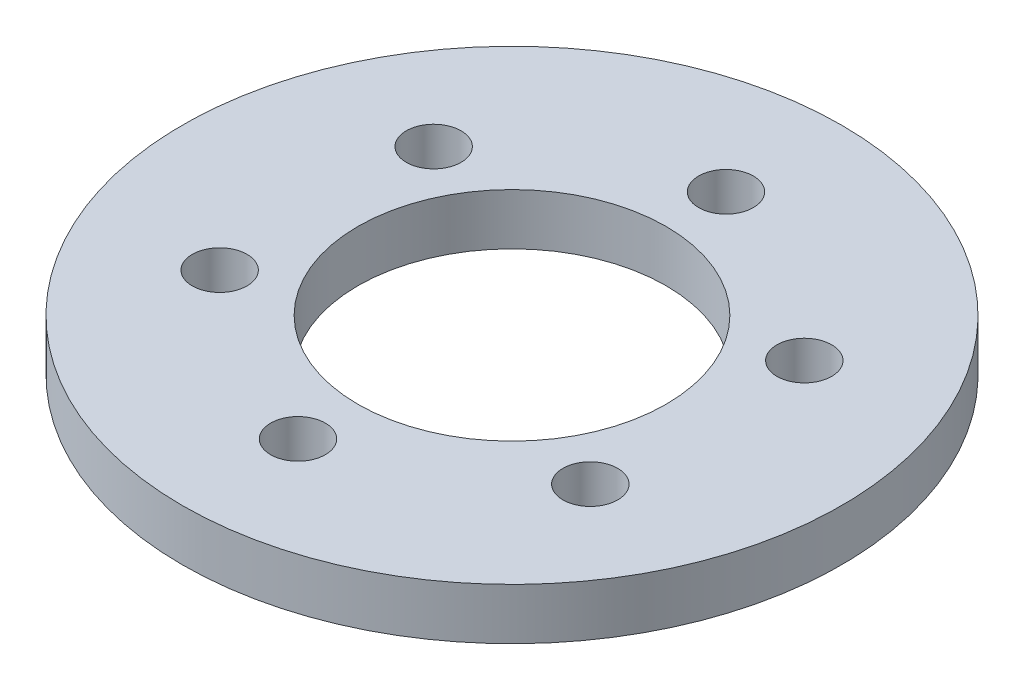
ISO-10303-21;
HEADER;
FILE_DESCRIPTION(('STEP AP214'),'2;1');
FILE_NAME('part.step','',(''),(''),'','','');
FILE_SCHEMA(('AUTOMOTIVE_DESIGN { 1 0 10303 214 1 1 1 1 }'));
ENDSEC;
DATA;
#1=APPLICATION_CONTEXT('core data for automotive mechanical design processes');
#2=APPLICATION_PROTOCOL_DEFINITION('international standard','automotive_design',2000,#1);
#3=PRODUCT_CONTEXT('',#1,'mechanical');
#4=PRODUCT('Part','Part','',(#3));
#5=PRODUCT_RELATED_PRODUCT_CATEGORY('part','',(#4));
#6=PRODUCT_DEFINITION_FORMATION('','',#4);
#7=PRODUCT_DEFINITION_CONTEXT('part definition',#1,'design');
#8=PRODUCT_DEFINITION('design','',#6,#7);
#9=PRODUCT_DEFINITION_SHAPE('','',#8);
#10=(LENGTH_UNIT() NAMED_UNIT(*) SI_UNIT(.MILLI.,.METRE.));
#11=(NAMED_UNIT(*) PLANE_ANGLE_UNIT() SI_UNIT($,.RADIAN.));
#12=(NAMED_UNIT(*) SI_UNIT($,.STERADIAN.) SOLID_ANGLE_UNIT());
#13=UNCERTAINTY_MEASURE_WITH_UNIT(LENGTH_MEASURE(1.E-05),#10,'distance_accuracy_value','');
#14=(GEOMETRIC_REPRESENTATION_CONTEXT(3) GLOBAL_UNCERTAINTY_ASSIGNED_CONTEXT((#13)) GLOBAL_UNIT_ASSIGNED_CONTEXT((#10,
#11,#12)) REPRESENTATION_CONTEXT('',''));
#15=CARTESIAN_POINT('',(0.,0.,0.));
#16=DIRECTION('',(0.,0.,1.));
#17=DIRECTION('',(1.,0.,0.));
#18=AXIS2_PLACEMENT_3D('',#15,#16,#17);
#19=CARTESIAN_POINT('',(0.,3.,0.));
#20=DIRECTION('',(0.,1.,0.));
#21=DIRECTION('',(0.,0.,1.));
#22=AXIS2_PLACEMENT_3D('',#19,#20,#21);
#23=PLANE('',#22);
#24=CARTESIAN_POINT('',(-10.8253175473055,3.,6.25000000000001));
#25=DIRECTION('',(0.,1.,0.));
#26=DIRECTION('',(0.,0.,1.));
#27=AXIS2_PLACEMENT_3D('',#24,#25,#26);
#28=CIRCLE('',#27,1.6);
#29=CARTESIAN_POINT('',(-10.8253175473055,3.,7.85000000000001));
#30=VERTEX_POINT('',#29);
#31=EDGE_CURVE('E71',#30,#30,#28,.T.);
#32=ORIENTED_EDGE('',*,*,#31,.F.);
#33=EDGE_LOOP('',(#32));
#34=FACE_BOUND('',#33,.T.);
#35=CARTESIAN_POINT('',(10.8253175473055,3.,6.25));
#36=DIRECTION('',(0.,1.,0.));
#37=DIRECTION('',(0.,0.,1.));
#38=AXIS2_PLACEMENT_3D('',#35,#36,#37);
#39=CIRCLE('',#38,1.6);
#40=CARTESIAN_POINT('',(10.8253175473055,3.,7.85));
#41=VERTEX_POINT('',#40);
#42=EDGE_CURVE('E59',#41,#41,#39,.T.);
#43=ORIENTED_EDGE('',*,*,#42,.F.);
#44=EDGE_LOOP('',(#43));
#45=FACE_BOUND('',#44,.T.);
#46=CARTESIAN_POINT('',(0.,3.,-12.5));
#47=DIRECTION('',(0.,1.,0.));
#48=DIRECTION('',(0.,0.,1.));
#49=AXIS2_PLACEMENT_3D('',#46,#47,#48);
#50=CIRCLE('',#49,1.6);
#51=CARTESIAN_POINT('',(0.,3.,-10.9));
#52=VERTEX_POINT('',#51);
#53=EDGE_CURVE('E47',#52,#52,#50,.T.);
#54=ORIENTED_EDGE('',*,*,#53,.F.);
#55=EDGE_LOOP('',(#54));
#56=FACE_BOUND('',#55,.T.);
#57=CARTESIAN_POINT('',(0.,3.,0.));
#58=DIRECTION('',(0.,1.,0.));
#59=DIRECTION('',(0.,0.,1.));
#60=AXIS2_PLACEMENT_3D('',#57,#58,#59);
#61=CIRCLE('',#60,19.25);
#62=CARTESIAN_POINT('',(0.,3.,19.25));
#63=VERTEX_POINT('',#62);
#64=EDGE_CURVE('E10',#63,#63,#61,.T.);
#65=ORIENTED_EDGE('',*,*,#64,.T.);
#66=EDGE_LOOP('',(#65));
#67=FACE_BOUND('',#66,.T.);
#68=CARTESIAN_POINT('',(0.,3.,0.));
#69=DIRECTION('',(0.,1.,0.));
#70=DIRECTION('',(0.,0.,1.));
#71=AXIS2_PLACEMENT_3D('',#68,#69,#70);
#72=CIRCLE('',#71,9.);
#73=CARTESIAN_POINT('',(0.,3.,9.));
#74=VERTEX_POINT('',#73);
#75=EDGE_CURVE('E42',#74,#74,#72,.T.);
#76=ORIENTED_EDGE('',*,*,#75,.F.);
#77=EDGE_LOOP('',(#76));
#78=FACE_BOUND('',#77,.T.);
#79=CARTESIAN_POINT('',(10.8253175473055,3.,-6.25));
#80=DIRECTION('',(0.,1.,0.));
#81=DIRECTION('',(0.,0.,1.));
#82=AXIS2_PLACEMENT_3D('',#79,#80,#81);
#83=CIRCLE('',#82,1.6);
#84=CARTESIAN_POINT('',(10.8253175473055,3.,-4.65));
#85=VERTEX_POINT('',#84);
#86=EDGE_CURVE('E53',#85,#85,#83,.T.);
#87=ORIENTED_EDGE('',*,*,#86,.F.);
#88=EDGE_LOOP('',(#87));
#89=FACE_BOUND('',#88,.T.);
#90=CARTESIAN_POINT('',(0.,3.,12.5));
#91=DIRECTION('',(0.,1.,0.));
#92=DIRECTION('',(0.,0.,1.));
#93=AXIS2_PLACEMENT_3D('',#90,#91,#92);
#94=CIRCLE('',#93,1.6);
#95=CARTESIAN_POINT('',(0.,3.,14.1));
#96=VERTEX_POINT('',#95);
#97=EDGE_CURVE('E65',#96,#96,#94,.T.);
#98=ORIENTED_EDGE('',*,*,#97,.F.);
#99=EDGE_LOOP('',(#98));
#100=FACE_BOUND('',#99,.T.);
#101=CARTESIAN_POINT('',(-10.8253175473055,3.,-6.24999999999999));
#102=DIRECTION('',(0.,1.,0.));
#103=DIRECTION('',(0.,0.,1.));
#104=AXIS2_PLACEMENT_3D('',#101,#102,#103);
#105=CIRCLE('',#104,1.6);
#106=CARTESIAN_POINT('',(-10.8253175473055,3.,-4.64999999999999));
#107=VERTEX_POINT('',#106);
#108=EDGE_CURVE('E77',#107,#107,#105,.T.);
#109=ORIENTED_EDGE('',*,*,#108,.F.);
#110=EDGE_LOOP('',(#109));
#111=FACE_BOUND('',#110,.T.);
#112=ADVANCED_FACE('F31',(#34,#45,#56,#67,#78,#89,#100,#111),#23,.T.);
#113=CARTESIAN_POINT('',(0.,0.,0.));
#114=DIRECTION('',(0.,1.,0.));
#115=DIRECTION('',(0.,0.,1.));
#116=AXIS2_PLACEMENT_3D('',#113,#114,#115);
#117=PLANE('',#116);
#118=CARTESIAN_POINT('',(0.,0.,0.));
#119=DIRECTION('',(0.,1.,0.));
#120=DIRECTION('',(0.,0.,1.));
#121=AXIS2_PLACEMENT_3D('',#118,#119,#120);
#122=CIRCLE('',#121,19.25);
#123=CARTESIAN_POINT('',(0.,0.,19.25));
#124=VERTEX_POINT('',#123);
#125=EDGE_CURVE('E35',#124,#124,#122,.T.);
#126=ORIENTED_EDGE('',*,*,#125,.F.);
#127=EDGE_LOOP('',(#126));
#128=FACE_BOUND('',#127,.T.);
#129=CARTESIAN_POINT('',(0.,0.,0.));
#130=DIRECTION('',(0.,1.,0.));
#131=DIRECTION('',(0.,0.,1.));
#132=AXIS2_PLACEMENT_3D('',#129,#130,#131);
#133=CIRCLE('',#132,9.);
#134=CARTESIAN_POINT('',(0.,0.,9.));
#135=VERTEX_POINT('',#134);
#136=EDGE_CURVE('E44',#135,#135,#133,.T.);
#137=ORIENTED_EDGE('',*,*,#136,.T.);
#138=EDGE_LOOP('',(#137));
#139=FACE_BOUND('',#138,.T.);
#140=CARTESIAN_POINT('',(0.,0.,-12.5));
#141=DIRECTION('',(0.,1.,0.));
#142=DIRECTION('',(0.,0.,1.));
#143=AXIS2_PLACEMENT_3D('',#140,#141,#142);
#144=CIRCLE('',#143,1.6);
#145=CARTESIAN_POINT('',(0.,0.,-10.9));
#146=VERTEX_POINT('',#145);
#147=EDGE_CURVE('E50',#146,#146,#144,.T.);
#148=ORIENTED_EDGE('',*,*,#147,.T.);
#149=EDGE_LOOP('',(#148));
#150=FACE_BOUND('',#149,.T.);
#151=CARTESIAN_POINT('',(10.8253175473055,0.,-6.25));
#152=DIRECTION('',(0.,1.,0.));
#153=DIRECTION('',(0.,0.,1.));
#154=AXIS2_PLACEMENT_3D('',#151,#152,#153);
#155=CIRCLE('',#154,1.6);
#156=CARTESIAN_POINT('',(10.8253175473055,0.,-4.65));
#157=VERTEX_POINT('',#156);
#158=EDGE_CURVE('E56',#157,#157,#155,.T.);
#159=ORIENTED_EDGE('',*,*,#158,.T.);
#160=EDGE_LOOP('',(#159));
#161=FACE_BOUND('',#160,.T.);
#162=CARTESIAN_POINT('',(10.8253175473055,0.,6.25));
#163=DIRECTION('',(0.,1.,0.));
#164=DIRECTION('',(0.,0.,1.));
#165=AXIS2_PLACEMENT_3D('',#162,#163,#164);
#166=CIRCLE('',#165,1.6);
#167=CARTESIAN_POINT('',(10.8253175473055,0.,7.85));
#168=VERTEX_POINT('',#167);
#169=EDGE_CURVE('E62',#168,#168,#166,.T.);
#170=ORIENTED_EDGE('',*,*,#169,.T.);
#171=EDGE_LOOP('',(#170));
#172=FACE_BOUND('',#171,.T.);
#173=CARTESIAN_POINT('',(0.,0.,12.5));
#174=DIRECTION('',(0.,1.,0.));
#175=DIRECTION('',(0.,0.,1.));
#176=AXIS2_PLACEMENT_3D('',#173,#174,#175);
#177=CIRCLE('',#176,1.6);
#178=CARTESIAN_POINT('',(0.,0.,14.1));
#179=VERTEX_POINT('',#178);
#180=EDGE_CURVE('E68',#179,#179,#177,.T.);
#181=ORIENTED_EDGE('',*,*,#180,.T.);
#182=EDGE_LOOP('',(#181));
#183=FACE_BOUND('',#182,.T.);
#184=CARTESIAN_POINT('',(-10.8253175473055,0.,6.25000000000001));
#185=DIRECTION('',(0.,1.,0.));
#186=DIRECTION('',(0.,0.,1.));
#187=AXIS2_PLACEMENT_3D('',#184,#185,#186);
#188=CIRCLE('',#187,1.6);
#189=CARTESIAN_POINT('',(-10.8253175473055,0.,7.85000000000001));
#190=VERTEX_POINT('',#189);
#191=EDGE_CURVE('E74',#190,#190,#188,.T.);
#192=ORIENTED_EDGE('',*,*,#191,.T.);
#193=EDGE_LOOP('',(#192));
#194=FACE_BOUND('',#193,.T.);
#195=CARTESIAN_POINT('',(-10.8253175473055,0.,-6.24999999999999));
#196=DIRECTION('',(0.,1.,0.));
#197=DIRECTION('',(0.,0.,1.));
#198=AXIS2_PLACEMENT_3D('',#195,#196,#197);
#199=CIRCLE('',#198,1.6);
#200=CARTESIAN_POINT('',(-10.8253175473055,0.,-4.64999999999999));
#201=VERTEX_POINT('',#200);
#202=EDGE_CURVE('E80',#201,#201,#199,.T.);
#203=ORIENTED_EDGE('',*,*,#202,.T.);
#204=EDGE_LOOP('',(#203));
#205=FACE_BOUND('',#204,.T.);
#206=ADVANCED_FACE('F90',(#128,#139,#150,#161,#172,#183,#194,#205),#117,.F.);
#207=CARTESIAN_POINT('',(0.,3.,0.));
#208=DIRECTION('',(0.,-1.,0.));
#209=DIRECTION('',(0.,0.,-1.));
#210=AXIS2_PLACEMENT_3D('',#207,#208,#209);
#211=CYLINDRICAL_SURFACE('',#210,19.25);
#212=ORIENTED_EDGE('',*,*,#64,.F.);
#213=EDGE_LOOP('',(#212));
#214=FACE_BOUND('',#213,.T.);
#215=ORIENTED_EDGE('',*,*,#125,.T.);
#216=EDGE_LOOP('',(#215));
#217=FACE_BOUND('',#216,.T.);
#218=ADVANCED_FACE('F33',(#214,#217),#211,.T.);
#219=CARTESIAN_POINT('',(0.,3.,0.));
#220=DIRECTION('',(0.,-1.,0.));
#221=DIRECTION('',(0.,0.,-1.));
#222=AXIS2_PLACEMENT_3D('',#219,#220,#221);
#223=CYLINDRICAL_SURFACE('',#222,9.);
#224=ORIENTED_EDGE('',*,*,#75,.T.);
#225=EDGE_LOOP('',(#224));
#226=FACE_BOUND('',#225,.T.);
#227=ORIENTED_EDGE('',*,*,#136,.F.);
#228=EDGE_LOOP('',(#227));
#229=FACE_BOUND('',#228,.T.);
#230=ADVANCED_FACE('F100',(#226,#229),#223,.F.);
#231=CARTESIAN_POINT('',(0.,3.,-12.5));
#232=DIRECTION('',(0.,-1.,0.));
#233=DIRECTION('',(0.,0.,-1.));
#234=AXIS2_PLACEMENT_3D('',#231,#232,#233);
#235=CYLINDRICAL_SURFACE('',#234,1.6);
#236=ORIENTED_EDGE('',*,*,#53,.T.);
#237=EDGE_LOOP('',(#236));
#238=FACE_BOUND('',#237,.T.);
#239=ORIENTED_EDGE('',*,*,#147,.F.);
#240=EDGE_LOOP('',(#239));
#241=FACE_BOUND('',#240,.T.);
#242=ADVANCED_FACE('F103',(#238,#241),#235,.F.);
#243=CARTESIAN_POINT('',(10.8253175473055,3.,-6.25));
#244=DIRECTION('',(0.,-1.,0.));
#245=DIRECTION('',(0.,0.,-1.));
#246=AXIS2_PLACEMENT_3D('',#243,#244,#245);
#247=CYLINDRICAL_SURFACE('',#246,1.6);
#248=ORIENTED_EDGE('',*,*,#86,.T.);
#249=EDGE_LOOP('',(#248));
#250=FACE_BOUND('',#249,.T.);
#251=ORIENTED_EDGE('',*,*,#158,.F.);
#252=EDGE_LOOP('',(#251));
#253=FACE_BOUND('',#252,.T.);
#254=ADVANCED_FACE('F107',(#250,#253),#247,.F.);
#255=CARTESIAN_POINT('',(10.8253175473055,3.,6.25));
#256=DIRECTION('',(0.,-1.,0.));
#257=DIRECTION('',(0.,0.,-1.));
#258=AXIS2_PLACEMENT_3D('',#255,#256,#257);
#259=CYLINDRICAL_SURFACE('',#258,1.6);
#260=ORIENTED_EDGE('',*,*,#42,.T.);
#261=EDGE_LOOP('',(#260));
#262=FACE_BOUND('',#261,.T.);
#263=ORIENTED_EDGE('',*,*,#169,.F.);
#264=EDGE_LOOP('',(#263));
#265=FACE_BOUND('',#264,.T.);
#266=ADVANCED_FACE('F111',(#262,#265),#259,.F.);
#267=CARTESIAN_POINT('',(0.,3.,12.5));
#268=DIRECTION('',(0.,-1.,0.));
#269=DIRECTION('',(0.,0.,-1.));
#270=AXIS2_PLACEMENT_3D('',#267,#268,#269);
#271=CYLINDRICAL_SURFACE('',#270,1.6);
#272=ORIENTED_EDGE('',*,*,#97,.T.);
#273=EDGE_LOOP('',(#272));
#274=FACE_BOUND('',#273,.T.);
#275=ORIENTED_EDGE('',*,*,#180,.F.);
#276=EDGE_LOOP('',(#275));
#277=FACE_BOUND('',#276,.T.);
#278=ADVANCED_FACE('F115',(#274,#277),#271,.F.);
#279=CARTESIAN_POINT('',(-10.8253175473055,3.,6.25000000000001));
#280=DIRECTION('',(0.,-1.,0.));
#281=DIRECTION('',(0.,0.,-1.));
#282=AXIS2_PLACEMENT_3D('',#279,#280,#281);
#283=CYLINDRICAL_SURFACE('',#282,1.6);
#284=ORIENTED_EDGE('',*,*,#31,.T.);
#285=EDGE_LOOP('',(#284));
#286=FACE_BOUND('',#285,.T.);
#287=ORIENTED_EDGE('',*,*,#191,.F.);
#288=EDGE_LOOP('',(#287));
#289=FACE_BOUND('',#288,.T.);
#290=ADVANCED_FACE('F119',(#286,#289),#283,.F.);
#291=CARTESIAN_POINT('',(-10.8253175473055,3.,-6.24999999999999));
#292=DIRECTION('',(0.,-1.,0.));
#293=DIRECTION('',(0.,0.,-1.));
#294=AXIS2_PLACEMENT_3D('',#291,#292,#293);
#295=CYLINDRICAL_SURFACE('',#294,1.6);
#296=ORIENTED_EDGE('',*,*,#108,.T.);
#297=EDGE_LOOP('',(#296));
#298=FACE_BOUND('',#297,.T.);
#299=ORIENTED_EDGE('',*,*,#202,.F.);
#300=EDGE_LOOP('',(#299));
#301=FACE_BOUND('',#300,.T.);
#302=ADVANCED_FACE('F86',(#298,#301),#295,.F.);
#303=CLOSED_SHELL('',(#112,#206,#218,#230,#242,#254,#266,#278,#290,#302));
#304=MANIFOLD_SOLID_BREP('B2',#303);
#305=ADVANCED_BREP_SHAPE_REPRESENTATION('',(#18,#304),#14);
#306=SHAPE_DEFINITION_REPRESENTATION(#9,#305);
ENDSEC;
END-ISO-10303-21;
